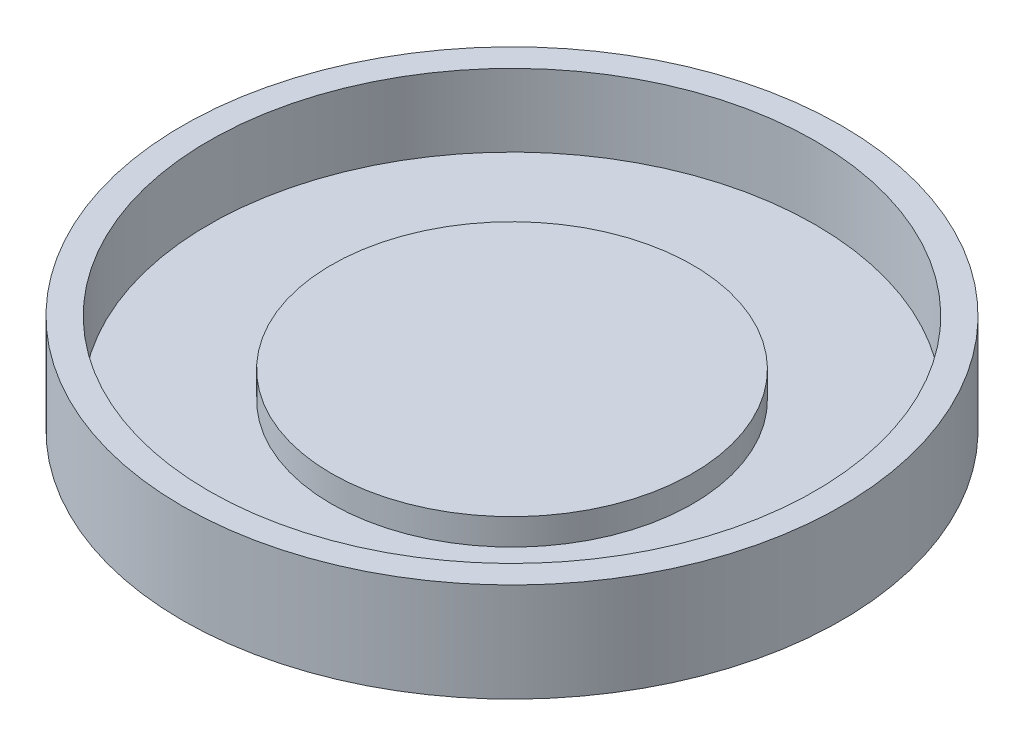
ISO-10303-21;
HEADER;
FILE_DESCRIPTION(('STEP AP214'),'2;1');
FILE_NAME('part.step','',(''),(''),'','','');
FILE_SCHEMA(('AUTOMOTIVE_DESIGN { 1 0 10303 214 1 1 1 1 }'));
ENDSEC;
DATA;
#1=APPLICATION_CONTEXT('core data for automotive mechanical design processes');
#2=APPLICATION_PROTOCOL_DEFINITION('international standard','automotive_design',2000,#1);
#3=PRODUCT_CONTEXT('',#1,'mechanical');
#4=PRODUCT('Part','Part','',(#3));
#5=PRODUCT_RELATED_PRODUCT_CATEGORY('part','',(#4));
#6=PRODUCT_DEFINITION_FORMATION('','',#4);
#7=PRODUCT_DEFINITION_CONTEXT('part definition',#1,'design');
#8=PRODUCT_DEFINITION('design','',#6,#7);
#9=PRODUCT_DEFINITION_SHAPE('','',#8);
#10=(LENGTH_UNIT() NAMED_UNIT(*) SI_UNIT(.MILLI.,.METRE.));
#11=(NAMED_UNIT(*) PLANE_ANGLE_UNIT() SI_UNIT($,.RADIAN.));
#12=(NAMED_UNIT(*) SI_UNIT($,.STERADIAN.) SOLID_ANGLE_UNIT());
#13=UNCERTAINTY_MEASURE_WITH_UNIT(LENGTH_MEASURE(1.E-05),#10,'distance_accuracy_value','');
#14=(GEOMETRIC_REPRESENTATION_CONTEXT(3) GLOBAL_UNCERTAINTY_ASSIGNED_CONTEXT((#13)) GLOBAL_UNIT_ASSIGNED_CONTEXT((#10,
#11,#12)) REPRESENTATION_CONTEXT('',''));
#15=CARTESIAN_POINT('',(0.,0.,0.));
#16=DIRECTION('',(0.,0.,1.));
#17=DIRECTION('',(1.,0.,0.));
#18=AXIS2_PLACEMENT_3D('',#15,#16,#17);
#19=CARTESIAN_POINT('',(0.,15.,0.));
#20=DIRECTION('',(0.,-1.,0.));
#21=DIRECTION('',(0.,0.,-1.));
#22=AXIS2_PLACEMENT_3D('',#19,#20,#21);
#23=CYLINDRICAL_SURFACE('',#22,50.);
#24=CARTESIAN_POINT('',(0.,15.,0.));
#25=DIRECTION('',(0.,1.,0.));
#26=DIRECTION('',(0.,0.,1.));
#27=AXIS2_PLACEMENT_3D('',#24,#25,#26);
#28=CIRCLE('',#27,50.);
#29=CARTESIAN_POINT('',(0.,15.,50.));
#30=VERTEX_POINT('',#29);
#31=EDGE_CURVE('E10',#30,#30,#28,.T.);
#32=ORIENTED_EDGE('',*,*,#31,.F.);
#33=EDGE_LOOP('',(#32));
#34=FACE_BOUND('',#33,.T.);
#35=CARTESIAN_POINT('',(0.,0.,0.));
#36=DIRECTION('',(0.,1.,0.));
#37=DIRECTION('',(0.,0.,1.));
#38=AXIS2_PLACEMENT_3D('',#35,#36,#37);
#39=CIRCLE('',#38,50.);
#40=CARTESIAN_POINT('',(0.,0.,50.));
#41=VERTEX_POINT('',#40);
#42=EDGE_CURVE('E38',#41,#41,#39,.T.);
#43=ORIENTED_EDGE('',*,*,#42,.T.);
#44=EDGE_LOOP('',(#43));
#45=FACE_BOUND('',#44,.T.);
#46=ADVANCED_FACE('F35',(#34,#45),#23,.T.);
#47=CARTESIAN_POINT('',(0.,15.,0.));
#48=DIRECTION('',(0.,1.,0.));
#49=DIRECTION('',(0.,0.,1.));
#50=AXIS2_PLACEMENT_3D('',#47,#48,#49);
#51=PLANE('',#50);
#52=CARTESIAN_POINT('',(0.,15.,0.));
#53=DIRECTION('',(0.,1.,0.));
#54=DIRECTION('',(0.,0.,1.));
#55=AXIS2_PLACEMENT_3D('',#52,#53,#54);
#56=CIRCLE('',#55,46.);
#57=CARTESIAN_POINT('',(0.,15.,46.));
#58=VERTEX_POINT('',#57);
#59=EDGE_CURVE('E45',#58,#58,#56,.T.);
#60=ORIENTED_EDGE('',*,*,#59,.F.);
#61=EDGE_LOOP('',(#60));
#62=FACE_BOUND('',#61,.T.);
#63=ORIENTED_EDGE('',*,*,#31,.T.);
#64=EDGE_LOOP('',(#63));
#65=FACE_BOUND('',#64,.T.);
#66=ADVANCED_FACE('F81',(#62,#65),#51,.T.);
#67=CARTESIAN_POINT('',(0.,0.,0.));
#68=DIRECTION('',(0.,1.,0.));
#69=DIRECTION('',(0.,0.,1.));
#70=AXIS2_PLACEMENT_3D('',#67,#68,#69);
#71=PLANE('',#70);
#72=ORIENTED_EDGE('',*,*,#42,.F.);
#73=EDGE_LOOP('',(#72));
#74=FACE_BOUND('',#73,.T.);
#75=ADVANCED_FACE('F75',(#74),#71,.F.);
#76=CARTESIAN_POINT('',(0.,15.,0.));
#77=DIRECTION('',(0.,-1.,0.));
#78=DIRECTION('',(0.,0.,-1.));
#79=AXIS2_PLACEMENT_3D('',#76,#77,#78);
#80=CYLINDRICAL_SURFACE('',#79,46.);
#81=ORIENTED_EDGE('',*,*,#59,.T.);
#82=EDGE_LOOP('',(#81));
#83=FACE_BOUND('',#82,.T.);
#84=CARTESIAN_POINT('',(0.,4.,0.));
#85=DIRECTION('',(0.,1.,0.));
#86=DIRECTION('',(0.,0.,1.));
#87=AXIS2_PLACEMENT_3D('',#84,#85,#86);
#88=CIRCLE('',#87,46.);
#89=CARTESIAN_POINT('',(0.,4.,46.));
#90=VERTEX_POINT('',#89);
#91=EDGE_CURVE('E49',#90,#90,#88,.T.);
#92=ORIENTED_EDGE('',*,*,#91,.F.);
#93=EDGE_LOOP('',(#92));
#94=FACE_BOUND('',#93,.T.);
#95=ADVANCED_FACE('F70',(#83,#94),#80,.F.);
#96=CARTESIAN_POINT('',(0.,4.,0.));
#97=DIRECTION('',(0.,1.,0.));
#98=DIRECTION('',(0.,0.,1.));
#99=AXIS2_PLACEMENT_3D('',#96,#97,#98);
#100=PLANE('',#99);
#101=CARTESIAN_POINT('',(0.,4.,0.));
#102=DIRECTION('',(0.,1.,0.));
#103=DIRECTION('',(0.,0.,1.));
#104=AXIS2_PLACEMENT_3D('',#101,#102,#103);
#105=CIRCLE('',#104,27.405);
#106=CARTESIAN_POINT('',(0.,4.,27.405));
#107=VERTEX_POINT('',#106);
#108=EDGE_CURVE('E53',#107,#107,#105,.T.);
#109=ORIENTED_EDGE('',*,*,#108,.F.);
#110=EDGE_LOOP('',(#109));
#111=FACE_BOUND('',#110,.T.);
#112=ORIENTED_EDGE('',*,*,#91,.T.);
#113=EDGE_LOOP('',(#112));
#114=FACE_BOUND('',#113,.T.);
#115=ADVANCED_FACE('F64',(#111,#114),#100,.T.);
#116=CARTESIAN_POINT('',(0.,8.,0.));
#117=DIRECTION('',(0.,-1.,0.));
#118=DIRECTION('',(0.,0.,-1.));
#119=AXIS2_PLACEMENT_3D('',#116,#117,#118);
#120=CYLINDRICAL_SURFACE('',#119,27.405);
#121=CARTESIAN_POINT('',(0.,8.,0.));
#122=DIRECTION('',(0.,1.,0.));
#123=DIRECTION('',(0.,0.,1.));
#124=AXIS2_PLACEMENT_3D('',#121,#122,#123);
#125=CIRCLE('',#124,27.405);
#126=CARTESIAN_POINT('',(0.,8.,27.405));
#127=VERTEX_POINT('',#126);
#128=EDGE_CURVE('E52',#127,#127,#125,.T.);
#129=ORIENTED_EDGE('',*,*,#128,.F.);
#130=EDGE_LOOP('',(#129));
#131=FACE_BOUND('',#130,.T.);
#132=ORIENTED_EDGE('',*,*,#108,.T.);
#133=EDGE_LOOP('',(#132));
#134=FACE_BOUND('',#133,.T.);
#135=ADVANCED_FACE('F61',(#131,#134),#120,.T.);
#136=CARTESIAN_POINT('',(0.,8.,0.));
#137=DIRECTION('',(0.,1.,0.));
#138=DIRECTION('',(0.,0.,1.));
#139=AXIS2_PLACEMENT_3D('',#136,#137,#138);
#140=PLANE('',#139);
#141=ORIENTED_EDGE('',*,*,#128,.T.);
#142=EDGE_LOOP('',(#141));
#143=FACE_BOUND('',#142,.T.);
#144=ADVANCED_FACE('F59',(#143),#140,.T.);
#145=CLOSED_SHELL('',(#46,#66,#75,#95,#115,#135,#144));
#146=MANIFOLD_SOLID_BREP('B2',#145);
#147=ADVANCED_BREP_SHAPE_REPRESENTATION('',(#18,#146),#14);
#148=SHAPE_DEFINITION_REPRESENTATION(#9,#147);
ENDSEC;
END-ISO-10303-21;
